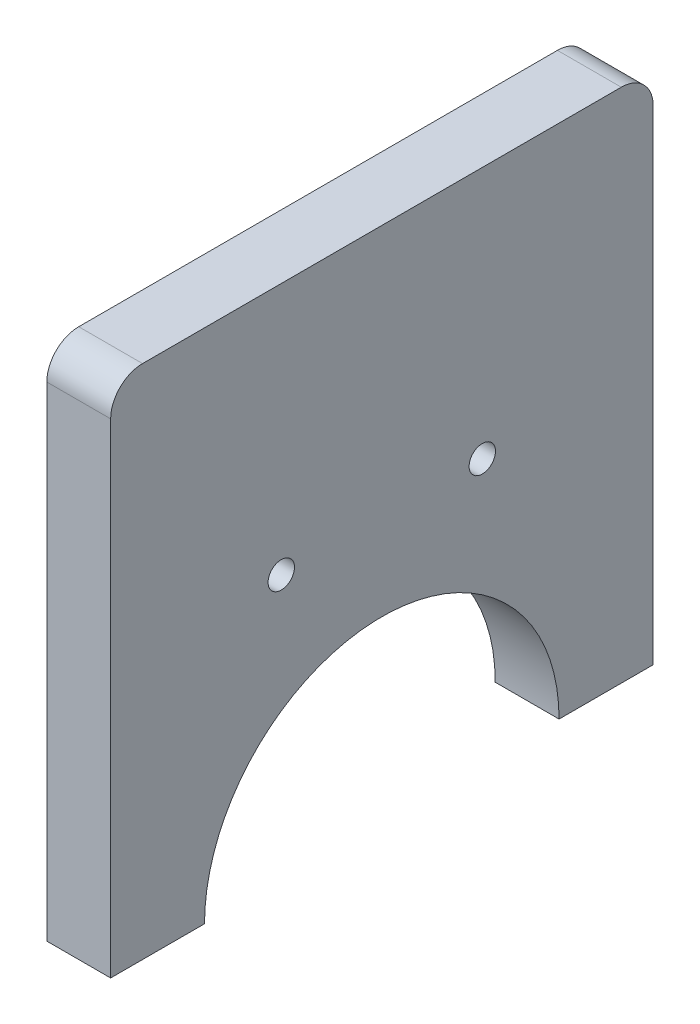
ISO-10303-21;
HEADER;
FILE_DESCRIPTION(('STEP AP214'),'2;1');
FILE_NAME('part.step','',(''),(''),'','','');
FILE_SCHEMA(('AUTOMOTIVE_DESIGN { 1 0 10303 214 1 1 1 1 }'));
ENDSEC;
DATA;
#1=APPLICATION_CONTEXT('core data for automotive mechanical design processes');
#2=APPLICATION_PROTOCOL_DEFINITION('international standard','automotive_design',2000,#1);
#3=PRODUCT_CONTEXT('',#1,'mechanical');
#4=PRODUCT('Part','Part','',(#3));
#5=PRODUCT_RELATED_PRODUCT_CATEGORY('part','',(#4));
#6=PRODUCT_DEFINITION_FORMATION('','',#4);
#7=PRODUCT_DEFINITION_CONTEXT('part definition',#1,'design');
#8=PRODUCT_DEFINITION('design','',#6,#7);
#9=PRODUCT_DEFINITION_SHAPE('','',#8);
#10=(LENGTH_UNIT() NAMED_UNIT(*) SI_UNIT(.MILLI.,.METRE.));
#11=(NAMED_UNIT(*) PLANE_ANGLE_UNIT() SI_UNIT($,.RADIAN.));
#12=(NAMED_UNIT(*) SI_UNIT($,.STERADIAN.) SOLID_ANGLE_UNIT());
#13=UNCERTAINTY_MEASURE_WITH_UNIT(LENGTH_MEASURE(1.E-05),#10,'distance_accuracy_value','');
#14=(GEOMETRIC_REPRESENTATION_CONTEXT(3) GLOBAL_UNCERTAINTY_ASSIGNED_CONTEXT((#13)) GLOBAL_UNIT_ASSIGNED_CONTEXT((#10,
#11,#12)) REPRESENTATION_CONTEXT('',''));
#15=CARTESIAN_POINT('',(0.,0.,0.));
#16=DIRECTION('',(0.,0.,1.));
#17=DIRECTION('',(1.,0.,0.));
#18=AXIS2_PLACEMENT_3D('',#15,#16,#17);
#19=CARTESIAN_POINT('',(-19.2936990347413,28.5958374657424,20.6304286058353));
#20=DIRECTION('',(-1.,0.,0.));
#21=DIRECTION('',(0.,0.,1.));
#22=AXIS2_PLACEMENT_3D('',#19,#20,#21);
#23=PLANE('',#22);
#24=CARTESIAN_POINT('',(-19.2936990347413,32.5958374657424,50.2304286058353));
#25=DIRECTION('',(-1.,0.,0.));
#26=DIRECTION('',(0.,0.,1.));
#27=AXIS2_PLACEMENT_3D('',#24,#25,#26);
#28=CIRCLE('',#27,1.05000000000564);
#29=CARTESIAN_POINT('',(-19.2936990347413,32.5958374657424,51.280428605841));
#30=VERTEX_POINT('',#29);
#31=EDGE_CURVE('E142',#30,#30,#28,.T.);
#32=ORIENTED_EDGE('',*,*,#31,.F.);
#33=EDGE_LOOP('',(#32));
#34=FACE_BOUND('',#33,.T.);
#35=DIRECTION('',(0.,-1.,0.));
#36=VECTOR('',#35,1.);
#37=CARTESIAN_POINT('',(-19.2936990347413,28.5958374657424,63.8104286058353));
#38=LINE('',#37,#36);
#39=CARTESIAN_POINT('',(-19.2936990347413,50.1358374657424,63.8104286058353));
#40=VERTEX_POINT('',#39);
#41=CARTESIAN_POINT('',(-19.2936990347413,11.5958374657424,63.8104286058353));
#42=VERTEX_POINT('',#41);
#43=EDGE_CURVE('E111',#40,#42,#38,.T.);
#44=ORIENTED_EDGE('',*,*,#43,.F.);
#45=CARTESIAN_POINT('',(-19.2936990347413,50.1358374657424,61.2704286058353));
#46=DIRECTION('',(-1.,0.,0.));
#47=DIRECTION('',(0.,0.,1.));
#48=AXIS2_PLACEMENT_3D('',#45,#46,#47);
#49=CIRCLE('',#48,2.54);
#50=CARTESIAN_POINT('',(-19.2936990347413,52.6758374657424,61.2704286058353));
#51=VERTEX_POINT('',#50);
#52=EDGE_CURVE('E59',#40,#51,#49,.T.);
#53=ORIENTED_EDGE('',*,*,#52,.T.);
#54=DIRECTION('',(0.,0.,1.));
#55=VECTOR('',#54,1.);
#56=CARTESIAN_POINT('',(-19.2936990347413,52.6758374657424,20.6304286058353));
#57=LINE('',#56,#55);
#58=CARTESIAN_POINT('',(-19.2936990347413,52.6758374657424,23.1704286058353));
#59=VERTEX_POINT('',#58);
#60=EDGE_CURVE('E125',#59,#51,#57,.T.);
#61=ORIENTED_EDGE('',*,*,#60,.F.);
#62=CARTESIAN_POINT('',(-19.2936990347413,50.1358374657424,23.1704286058353));
#63=DIRECTION('',(-1.,0.,0.));
#64=DIRECTION('',(0.,0.,1.));
#65=AXIS2_PLACEMENT_3D('',#62,#63,#64);
#66=CIRCLE('',#65,2.54);
#67=CARTESIAN_POINT('',(-19.2936990347413,50.1358374657424,20.6304286058353));
#68=VERTEX_POINT('',#67);
#69=EDGE_CURVE('E120',#59,#68,#66,.T.);
#70=ORIENTED_EDGE('',*,*,#69,.T.);
#71=DIRECTION('',(0.,-1.,0.));
#72=VECTOR('',#71,1.);
#73=CARTESIAN_POINT('',(-19.2936990347413,28.5958374657424,20.6304286058353));
#74=LINE('',#73,#72);
#75=CARTESIAN_POINT('',(-19.2936990347413,11.5958374657423,20.6304286058353));
#76=VERTEX_POINT('',#75);
#77=EDGE_CURVE('E135',#68,#76,#74,.T.);
#78=ORIENTED_EDGE('',*,*,#77,.T.);
#79=DIRECTION('',(0.,0.,1.));
#80=VECTOR('',#79,1.);
#81=CARTESIAN_POINT('',(-19.2936990347413,11.595837465742,-1.53074712182389E-13));
#82=LINE('',#81,#80);
#83=CARTESIAN_POINT('',(-19.2936990347413,11.5958374657424,28.120807374169));
#84=VERTEX_POINT('',#83);
#85=EDGE_CURVE('E174',#76,#84,#82,.T.);
#86=ORIENTED_EDGE('',*,*,#85,.T.);
#87=CARTESIAN_POINT('',(-19.2936990347413,11.5958374657424,42.2304286058353));
#88=DIRECTION('',(-1.,0.,0.));
#89=DIRECTION('',(0.,0.,1.));
#90=AXIS2_PLACEMENT_3D('',#87,#88,#89);
#91=CIRCLE('',#90,14.1096212316664);
#92=CARTESIAN_POINT('',(-19.2936990347413,11.5958374657424,56.3400498375017));
#93=VERTEX_POINT('',#92);
#94=EDGE_CURVE('E173',#93,#84,#91,.T.);
#95=ORIENTED_EDGE('',*,*,#94,.F.);
#96=DIRECTION('',(0.,0.,1.));
#97=VECTOR('',#96,1.);
#98=CARTESIAN_POINT('',(-19.2936990347413,11.5958374657424,0.));
#99=LINE('',#98,#97);
#100=EDGE_CURVE('E167',#93,#42,#99,.T.);
#101=ORIENTED_EDGE('',*,*,#100,.T.);
#102=EDGE_LOOP('',(#44,#53,#61,#70,#78,#86,#95,#101));
#103=FACE_BOUND('',#102,.T.);
#104=CARTESIAN_POINT('',(-19.2936990347413,32.5958374657424,34.2304286058353));
#105=DIRECTION('',(-1.,0.,0.));
#106=DIRECTION('',(0.,0.,1.));
#107=AXIS2_PLACEMENT_3D('',#104,#105,#106);
#108=CIRCLE('',#107,1.05000000000564);
#109=CARTESIAN_POINT('',(-19.2936990347413,32.5958374657424,35.280428605841));
#110=VERTEX_POINT('',#109);
#111=EDGE_CURVE('E145',#110,#110,#108,.T.);
#112=ORIENTED_EDGE('',*,*,#111,.F.);
#113=EDGE_LOOP('',(#112));
#114=FACE_BOUND('',#113,.T.);
#115=ADVANCED_FACE('F37',(#34,#103,#114),#23,.T.);
#116=CARTESIAN_POINT('',(-14.2136990347413,28.5958374657424,20.6304286058353));
#117=DIRECTION('',(1.,0.,0.));
#118=DIRECTION('',(0.,0.,-1.));
#119=AXIS2_PLACEMENT_3D('',#116,#117,#118);
#120=PLANE('',#119);
#121=DIRECTION('',(0.,1.,0.));
#122=VECTOR('',#121,1.);
#123=CARTESIAN_POINT('',(-14.2136990347413,28.5958374657424,20.6304286058353));
#124=LINE('',#123,#122);
#125=CARTESIAN_POINT('',(-14.2136990347413,11.5958374657423,20.6304286058353));
#126=VERTEX_POINT('',#125);
#127=CARTESIAN_POINT('',(-14.2136990347413,50.1358374657424,20.6304286058353));
#128=VERTEX_POINT('',#127);
#129=EDGE_CURVE('E137',#126,#128,#124,.T.);
#130=ORIENTED_EDGE('',*,*,#129,.T.);
#131=CARTESIAN_POINT('',(-14.2136990347413,50.1358374657424,23.1704286058353));
#132=DIRECTION('',(-1.,0.,0.));
#133=DIRECTION('',(0.,0.,1.));
#134=AXIS2_PLACEMENT_3D('',#131,#132,#133);
#135=CIRCLE('',#134,2.54);
#136=CARTESIAN_POINT('',(-14.2136990347413,52.6758374657424,23.1704286058353));
#137=VERTEX_POINT('',#136);
#138=EDGE_CURVE('E178',#128,#137,#135,.F.);
#139=ORIENTED_EDGE('',*,*,#138,.T.);
#140=DIRECTION('',(0.,0.,1.));
#141=VECTOR('',#140,1.);
#142=CARTESIAN_POINT('',(-14.2136990347413,52.6758374657424,20.6304286058353));
#143=LINE('',#142,#141);
#144=CARTESIAN_POINT('',(-14.2136990347413,52.6758374657424,61.2704286058353));
#145=VERTEX_POINT('',#144);
#146=EDGE_CURVE('E51',#137,#145,#143,.T.);
#147=ORIENTED_EDGE('',*,*,#146,.T.);
#148=CARTESIAN_POINT('',(-14.2136990347413,50.1358374657424,61.2704286058353));
#149=DIRECTION('',(-1.,0.,0.));
#150=DIRECTION('',(0.,0.,1.));
#151=AXIS2_PLACEMENT_3D('',#148,#149,#150);
#152=CIRCLE('',#151,2.54);
#153=CARTESIAN_POINT('',(-14.2136990347413,50.1358374657424,63.8104286058353));
#154=VERTEX_POINT('',#153);
#155=EDGE_CURVE('E11',#145,#154,#152,.F.);
#156=ORIENTED_EDGE('',*,*,#155,.T.);
#157=DIRECTION('',(0.,1.,0.));
#158=VECTOR('',#157,1.);
#159=CARTESIAN_POINT('',(-14.2136990347413,28.5958374657424,63.8104286058353));
#160=LINE('',#159,#158);
#161=CARTESIAN_POINT('',(-14.2136990347413,11.5958374657424,63.8104286058353));
#162=VERTEX_POINT('',#161);
#163=EDGE_CURVE('E103',#162,#154,#160,.T.);
#164=ORIENTED_EDGE('',*,*,#163,.F.);
#165=DIRECTION('',(0.,0.,1.));
#166=VECTOR('',#165,1.);
#167=CARTESIAN_POINT('',(-14.2136990347413,11.5958374657424,0.));
#168=LINE('',#167,#166);
#169=CARTESIAN_POINT('',(-14.2136990347413,11.5958374657424,56.3400498375017));
#170=VERTEX_POINT('',#169);
#171=EDGE_CURVE('E168',#170,#162,#168,.T.);
#172=ORIENTED_EDGE('',*,*,#171,.F.);
#173=CARTESIAN_POINT('',(-14.2136990347413,11.5958374657424,42.2304286058353));
#174=DIRECTION('',(-1.,0.,0.));
#175=DIRECTION('',(0.,0.,1.));
#176=AXIS2_PLACEMENT_3D('',#173,#174,#175);
#177=CIRCLE('',#176,14.1096212316664);
#178=CARTESIAN_POINT('',(-14.2136990347413,11.5958374657424,28.120807374169));
#179=VERTEX_POINT('',#178);
#180=EDGE_CURVE('E176',#170,#179,#177,.T.);
#181=ORIENTED_EDGE('',*,*,#180,.T.);
#182=DIRECTION('',(0.,0.,1.));
#183=VECTOR('',#182,1.);
#184=CARTESIAN_POINT('',(-14.2136990347413,11.595837465742,-1.53074712182389E-13));
#185=LINE('',#184,#183);
#186=EDGE_CURVE('E198',#126,#179,#185,.T.);
#187=ORIENTED_EDGE('',*,*,#186,.F.);
#188=EDGE_LOOP('',(#130,#139,#147,#156,#164,#172,#181,#187));
#189=FACE_BOUND('',#188,.T.);
#190=CARTESIAN_POINT('',(-14.2136990347413,32.5958374657424,50.2304286058353));
#191=DIRECTION('',(1.,0.,0.));
#192=DIRECTION('',(0.,0.,-1.));
#193=AXIS2_PLACEMENT_3D('',#190,#191,#192);
#194=CIRCLE('',#193,1.05000000000564);
#195=CARTESIAN_POINT('',(-14.2136990347413,32.5958374657424,49.1804286058297));
#196=VERTEX_POINT('',#195);
#197=EDGE_CURVE('E112',#196,#196,#194,.F.);
#198=ORIENTED_EDGE('',*,*,#197,.T.);
#199=EDGE_LOOP('',(#198));
#200=FACE_BOUND('',#199,.T.);
#201=CARTESIAN_POINT('',(-14.2136990347413,32.5958374657424,34.2304286058353));
#202=DIRECTION('',(1.,0.,0.));
#203=DIRECTION('',(0.,0.,-1.));
#204=AXIS2_PLACEMENT_3D('',#201,#202,#203);
#205=CIRCLE('',#204,1.05000000000564);
#206=CARTESIAN_POINT('',(-14.2136990347413,32.5958374657424,33.1804286058297));
#207=VERTEX_POINT('',#206);
#208=EDGE_CURVE('E143',#207,#207,#205,.F.);
#209=ORIENTED_EDGE('',*,*,#208,.T.);
#210=EDGE_LOOP('',(#209));
#211=FACE_BOUND('',#210,.T.);
#212=ADVANCED_FACE('F114',(#189,#200,#211),#120,.T.);
#213=CARTESIAN_POINT('',(-19.2936990347413,52.6758374657424,20.6304286058353));
#214=DIRECTION('',(0.,1.,0.));
#215=DIRECTION('',(0.,0.,1.));
#216=AXIS2_PLACEMENT_3D('',#213,#214,#215);
#217=PLANE('',#216);
#218=ORIENTED_EDGE('',*,*,#146,.F.);
#219=DIRECTION('',(-1.,0.,0.));
#220=VECTOR('',#219,1.);
#221=CARTESIAN_POINT('',(-19.2936990347413,52.6758374657424,23.1704286058353));
#222=LINE('',#221,#220);
#223=EDGE_CURVE('E130',#137,#59,#222,.T.);
#224=ORIENTED_EDGE('',*,*,#223,.T.);
#225=ORIENTED_EDGE('',*,*,#60,.T.);
#226=DIRECTION('',(-1.,0.,0.));
#227=VECTOR('',#226,1.);
#228=CARTESIAN_POINT('',(41.8663009652587,52.6758374657424,61.2704286058353));
#229=LINE('',#228,#227);
#230=EDGE_CURVE('E45',#51,#145,#229,.F.);
#231=ORIENTED_EDGE('',*,*,#230,.T.);
#232=EDGE_LOOP('',(#218,#224,#225,#231));
#233=FACE_BOUND('',#232,.T.);
#234=ADVANCED_FACE('F132',(#233),#217,.T.);
#235=CARTESIAN_POINT('',(0.,0.,20.6304286058353));
#236=DIRECTION('',(0.,0.,-1.));
#237=DIRECTION('',(-1.,0.,0.));
#238=AXIS2_PLACEMENT_3D('',#235,#236,#237);
#239=PLANE('',#238);
#240=DIRECTION('',(-1.,0.,0.));
#241=VECTOR('',#240,1.);
#242=CARTESIAN_POINT('',(0.,50.1358374657424,20.6304286058353));
#243=LINE('',#242,#241);
#244=EDGE_CURVE('E121',#68,#128,#243,.F.);
#245=ORIENTED_EDGE('',*,*,#244,.T.);
#246=ORIENTED_EDGE('',*,*,#129,.F.);
#247=DIRECTION('',(-1.,0.,0.));
#248=VECTOR('',#247,1.);
#249=CARTESIAN_POINT('',(-14.2136990347413,11.5958374657423,20.6304286058353));
#250=LINE('',#249,#248);
#251=EDGE_CURVE('E155',#126,#76,#250,.T.);
#252=ORIENTED_EDGE('',*,*,#251,.T.);
#253=ORIENTED_EDGE('',*,*,#77,.F.);
#254=EDGE_LOOP('',(#245,#246,#252,#253));
#255=FACE_BOUND('',#254,.T.);
#256=ADVANCED_FACE('F187',(#255),#239,.T.);
#257=CARTESIAN_POINT('',(0.,0.,63.8104286058353));
#258=DIRECTION('',(0.,0.,-1.));
#259=DIRECTION('',(-1.,0.,0.));
#260=AXIS2_PLACEMENT_3D('',#257,#258,#259);
#261=PLANE('',#260);
#262=ORIENTED_EDGE('',*,*,#163,.T.);
#263=DIRECTION('',(-1.,0.,0.));
#264=VECTOR('',#263,1.);
#265=CARTESIAN_POINT('',(-19.2936990347413,50.1358374657424,63.8104286058353));
#266=LINE('',#265,#264);
#267=EDGE_CURVE('E106',#154,#40,#266,.T.);
#268=ORIENTED_EDGE('',*,*,#267,.T.);
#269=ORIENTED_EDGE('',*,*,#43,.T.);
#270=DIRECTION('',(-1.,0.,0.));
#271=VECTOR('',#270,1.);
#272=CARTESIAN_POINT('',(-14.2136990347413,11.5958374657424,63.8104286058353));
#273=LINE('',#272,#271);
#274=EDGE_CURVE('E108',#162,#42,#273,.T.);
#275=ORIENTED_EDGE('',*,*,#274,.F.);
#276=EDGE_LOOP('',(#262,#268,#269,#275));
#277=FACE_BOUND('',#276,.T.);
#278=ADVANCED_FACE('F104',(#277),#261,.F.);
#279=CARTESIAN_POINT('',(-19.2936990347413,32.5958374657424,50.2304286058353));
#280=DIRECTION('',(1.,0.,0.));
#281=DIRECTION('',(0.,0.,-1.));
#282=AXIS2_PLACEMENT_3D('',#279,#280,#281);
#283=CYLINDRICAL_SURFACE('',#282,1.05000000000564);
#284=ORIENTED_EDGE('',*,*,#197,.F.);
#285=EDGE_LOOP('',(#284));
#286=FACE_BOUND('',#285,.T.);
#287=ORIENTED_EDGE('',*,*,#31,.T.);
#288=EDGE_LOOP('',(#287));
#289=FACE_BOUND('',#288,.T.);
#290=ADVANCED_FACE('F210',(#286,#289),#283,.F.);
#291=CARTESIAN_POINT('',(-19.2936990347413,32.5958374657424,34.2304286058353));
#292=DIRECTION('',(1.,0.,0.));
#293=DIRECTION('',(0.,0.,-1.));
#294=AXIS2_PLACEMENT_3D('',#291,#292,#293);
#295=CYLINDRICAL_SURFACE('',#294,1.05000000000564);
#296=ORIENTED_EDGE('',*,*,#208,.F.);
#297=EDGE_LOOP('',(#296));
#298=FACE_BOUND('',#297,.T.);
#299=ORIENTED_EDGE('',*,*,#111,.T.);
#300=EDGE_LOOP('',(#299));
#301=FACE_BOUND('',#300,.T.);
#302=ADVANCED_FACE('F203',(#298,#301),#295,.F.);
#303=CARTESIAN_POINT('',(-14.2136990347413,11.5958374657424,42.2304286058353));
#304=DIRECTION('',(-1.,0.,0.));
#305=DIRECTION('',(0.,0.,1.));
#306=AXIS2_PLACEMENT_3D('',#303,#304,#305);
#307=CYLINDRICAL_SURFACE('',#306,14.1096212316664);
#308=ORIENTED_EDGE('',*,*,#94,.T.);
#309=DIRECTION('',(-1.,0.,0.));
#310=VECTOR('',#309,1.);
#311=CARTESIAN_POINT('',(-14.2136990347413,11.5958374657424,28.120807374169));
#312=LINE('',#311,#310);
#313=EDGE_CURVE('E151',#179,#84,#312,.T.);
#314=ORIENTED_EDGE('',*,*,#313,.F.);
#315=ORIENTED_EDGE('',*,*,#180,.F.);
#316=DIRECTION('',(-1.,0.,0.));
#317=VECTOR('',#316,1.);
#318=CARTESIAN_POINT('',(-14.2136990347413,11.5958374657424,56.3400498375017));
#319=LINE('',#318,#317);
#320=EDGE_CURVE('E158',#170,#93,#319,.T.);
#321=ORIENTED_EDGE('',*,*,#320,.T.);
#322=EDGE_LOOP('',(#308,#314,#315,#321));
#323=FACE_BOUND('',#322,.T.);
#324=ADVANCED_FACE('F201',(#323),#307,.F.);
#325=CARTESIAN_POINT('',(-14.2136990347413,11.595837465742,-1.53074712182389E-13));
#326=DIRECTION('',(0.,-1.,0.));
#327=DIRECTION('',(0.,0.,-1.));
#328=AXIS2_PLACEMENT_3D('',#325,#326,#327);
#329=PLANE('',#328);
#330=ORIENTED_EDGE('',*,*,#85,.F.);
#331=ORIENTED_EDGE('',*,*,#251,.F.);
#332=ORIENTED_EDGE('',*,*,#186,.T.);
#333=ORIENTED_EDGE('',*,*,#313,.T.);
#334=EDGE_LOOP('',(#330,#331,#332,#333));
#335=FACE_BOUND('',#334,.T.);
#336=ADVANCED_FACE('F191',(#335),#329,.T.);
#337=CARTESIAN_POINT('',(-14.2136990347413,11.5958374657424,0.));
#338=DIRECTION('',(0.,-1.,0.));
#339=DIRECTION('',(0.,0.,-1.));
#340=AXIS2_PLACEMENT_3D('',#337,#338,#339);
#341=PLANE('',#340);
#342=ORIENTED_EDGE('',*,*,#100,.F.);
#343=ORIENTED_EDGE('',*,*,#320,.F.);
#344=ORIENTED_EDGE('',*,*,#171,.T.);
#345=ORIENTED_EDGE('',*,*,#274,.T.);
#346=EDGE_LOOP('',(#342,#343,#344,#345));
#347=FACE_BOUND('',#346,.T.);
#348=ADVANCED_FACE('F166',(#347),#341,.T.);
#349=CARTESIAN_POINT('',(-19.2936990347413,50.1358374657424,23.1704286058353));
#350=DIRECTION('',(-1.,0.,0.));
#351=DIRECTION('',(0.,0.,1.));
#352=AXIS2_PLACEMENT_3D('',#349,#350,#351);
#353=CYLINDRICAL_SURFACE('',#352,2.54);
#354=ORIENTED_EDGE('',*,*,#138,.F.);
#355=ORIENTED_EDGE('',*,*,#244,.F.);
#356=ORIENTED_EDGE('',*,*,#69,.F.);
#357=ORIENTED_EDGE('',*,*,#223,.F.);
#358=EDGE_LOOP('',(#354,#355,#356,#357));
#359=FACE_BOUND('',#358,.T.);
#360=ADVANCED_FACE('F39',(#359),#353,.T.);
#361=CARTESIAN_POINT('',(0.,50.1358374657424,61.2704286058353));
#362=DIRECTION('',(1.,0.,0.));
#363=DIRECTION('',(0.,0.,-1.));
#364=AXIS2_PLACEMENT_3D('',#361,#362,#363);
#365=CYLINDRICAL_SURFACE('',#364,2.54);
#366=ORIENTED_EDGE('',*,*,#155,.F.);
#367=ORIENTED_EDGE('',*,*,#230,.F.);
#368=ORIENTED_EDGE('',*,*,#52,.F.);
#369=ORIENTED_EDGE('',*,*,#267,.F.);
#370=EDGE_LOOP('',(#366,#367,#368,#369));
#371=FACE_BOUND('',#370,.T.);
#372=ADVANCED_FACE('F119',(#371),#365,.T.);
#373=CLOSED_SHELL('',(#115,#212,#234,#256,#278,#290,#302,#324,#336,#348,#360,#372));
#374=MANIFOLD_SOLID_BREP('B2',#373);
#375=ADVANCED_BREP_SHAPE_REPRESENTATION('',(#18,#374),#14);
#376=SHAPE_DEFINITION_REPRESENTATION(#9,#375);
ENDSEC;
END-ISO-10303-21;
